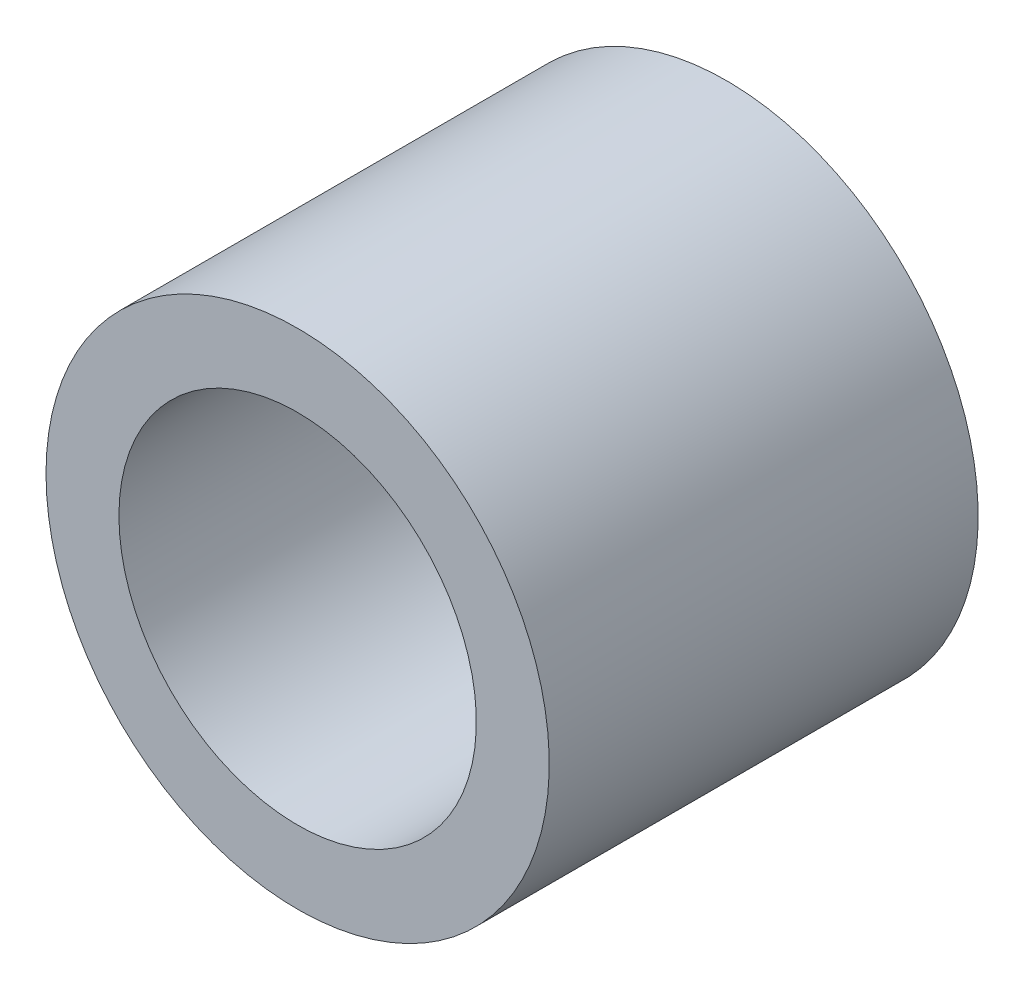
ISO-10303-21;
HEADER;
FILE_DESCRIPTION(('STEP AP214'),'2;1');
FILE_NAME('part.step','',(''),(''),'','','');
FILE_SCHEMA(('AUTOMOTIVE_DESIGN { 1 0 10303 214 1 1 1 1 }'));
ENDSEC;
DATA;
#1=APPLICATION_CONTEXT('core data for automotive mechanical design processes');
#2=APPLICATION_PROTOCOL_DEFINITION('international standard','automotive_design',2000,#1);
#3=PRODUCT_CONTEXT('',#1,'mechanical');
#4=PRODUCT('Part','Part','',(#3));
#5=PRODUCT_RELATED_PRODUCT_CATEGORY('part','',(#4));
#6=PRODUCT_DEFINITION_FORMATION('','',#4);
#7=PRODUCT_DEFINITION_CONTEXT('part definition',#1,'design');
#8=PRODUCT_DEFINITION('design','',#6,#7);
#9=PRODUCT_DEFINITION_SHAPE('','',#8);
#10=(LENGTH_UNIT() NAMED_UNIT(*) SI_UNIT(.MILLI.,.METRE.));
#11=(NAMED_UNIT(*) PLANE_ANGLE_UNIT() SI_UNIT($,.RADIAN.));
#12=(NAMED_UNIT(*) SI_UNIT($,.STERADIAN.) SOLID_ANGLE_UNIT());
#13=UNCERTAINTY_MEASURE_WITH_UNIT(LENGTH_MEASURE(1.E-05),#10,'distance_accuracy_value','');
#14=(GEOMETRIC_REPRESENTATION_CONTEXT(3) GLOBAL_UNCERTAINTY_ASSIGNED_CONTEXT((#13)) GLOBAL_UNIT_ASSIGNED_CONTEXT((#10,
#11,#12)) REPRESENTATION_CONTEXT('',''));
#15=CARTESIAN_POINT('',(0.,0.,0.));
#16=DIRECTION('',(0.,0.,1.));
#17=DIRECTION('',(1.,0.,0.));
#18=AXIS2_PLACEMENT_3D('',#15,#16,#17);
#19=CARTESIAN_POINT('',(0.,0.,4.7625));
#20=DIRECTION('',(0.,0.,1.));
#21=DIRECTION('',(1.,0.,0.));
#22=AXIS2_PLACEMENT_3D('',#19,#20,#21);
#23=PLANE('',#22);
#24=CARTESIAN_POINT('',(0.,0.,4.7625));
#25=DIRECTION('',(0.,0.,1.));
#26=DIRECTION('',(1.,0.,0.));
#27=AXIS2_PLACEMENT_3D('',#24,#25,#26);
#28=CIRCLE('',#27,5.588);
#29=CARTESIAN_POINT('',(-5.588,0.,4.7625));
#30=VERTEX_POINT('',#29);
#31=EDGE_CURVE('E10',#30,#30,#28,.T.);
#32=ORIENTED_EDGE('',*,*,#31,.T.);
#33=EDGE_LOOP('',(#32));
#34=FACE_BOUND('',#33,.T.);
#35=CARTESIAN_POINT('',(0.,0.,4.7625));
#36=DIRECTION('',(0.,0.,1.));
#37=DIRECTION('',(1.,0.,0.));
#38=AXIS2_PLACEMENT_3D('',#35,#36,#37);
#39=CIRCLE('',#38,3.96875);
#40=CARTESIAN_POINT('',(-3.96875,0.,4.7625));
#41=VERTEX_POINT('',#40);
#42=EDGE_CURVE('E42',#41,#41,#39,.T.);
#43=ORIENTED_EDGE('',*,*,#42,.F.);
#44=EDGE_LOOP('',(#43));
#45=FACE_BOUND('',#44,.T.);
#46=ADVANCED_FACE('F31',(#34,#45),#23,.T.);
#47=CARTESIAN_POINT('',(0.,0.,-4.7625));
#48=DIRECTION('',(0.,0.,1.));
#49=DIRECTION('',(1.,0.,0.));
#50=AXIS2_PLACEMENT_3D('',#47,#48,#49);
#51=PLANE('',#50);
#52=CARTESIAN_POINT('',(0.,0.,-4.7625));
#53=DIRECTION('',(0.,0.,1.));
#54=DIRECTION('',(1.,0.,0.));
#55=AXIS2_PLACEMENT_3D('',#52,#53,#54);
#56=CIRCLE('',#55,5.588);
#57=CARTESIAN_POINT('',(-5.588,0.,-4.7625));
#58=VERTEX_POINT('',#57);
#59=EDGE_CURVE('E35',#58,#58,#56,.T.);
#60=ORIENTED_EDGE('',*,*,#59,.F.);
#61=EDGE_LOOP('',(#60));
#62=FACE_BOUND('',#61,.T.);
#63=CARTESIAN_POINT('',(0.,0.,-4.7625));
#64=DIRECTION('',(0.,0.,1.));
#65=DIRECTION('',(1.,0.,0.));
#66=AXIS2_PLACEMENT_3D('',#63,#64,#65);
#67=CIRCLE('',#66,3.96875);
#68=CARTESIAN_POINT('',(-3.96875,0.,-4.7625));
#69=VERTEX_POINT('',#68);
#70=EDGE_CURVE('E44',#69,#69,#67,.T.);
#71=ORIENTED_EDGE('',*,*,#70,.T.);
#72=EDGE_LOOP('',(#71));
#73=FACE_BOUND('',#72,.T.);
#74=ADVANCED_FACE('F54',(#62,#73),#51,.F.);
#75=CARTESIAN_POINT('',(0.,0.,4.7625));
#76=DIRECTION('',(0.,0.,-1.));
#77=DIRECTION('',(-1.,0.,0.));
#78=AXIS2_PLACEMENT_3D('',#75,#76,#77);
#79=CYLINDRICAL_SURFACE('',#78,5.588);
#80=CARTESIAN_POINT('',(-5.588,0.,4.7625));
#81=CARTESIAN_POINT('',(-5.588,0.,4.66328125));
#82=CARTESIAN_POINT('',(-5.588,0.,4.5640625));
#83=CARTESIAN_POINT('',(-5.588,0.,4.365625));
#84=CARTESIAN_POINT('',(-5.588,0.,4.26640625));
#85=CARTESIAN_POINT('',(-5.588,0.,4.06796875));
#86=CARTESIAN_POINT('',(-5.588,0.,3.96875));
#87=CARTESIAN_POINT('',(-5.588,0.,3.7703125));
#88=CARTESIAN_POINT('',(-5.588,0.,3.67109375));
#89=CARTESIAN_POINT('',(-5.588,0.,3.47265625));
#90=CARTESIAN_POINT('',(-5.588,0.,3.3734375));
#91=CARTESIAN_POINT('',(-5.588,0.,3.175));
#92=CARTESIAN_POINT('',(-5.588,0.,3.07578125));
#93=CARTESIAN_POINT('',(-5.588,0.,2.87734375));
#94=CARTESIAN_POINT('',(-5.588,0.,2.778125));
#95=CARTESIAN_POINT('',(-5.588,0.,2.5796875));
#96=CARTESIAN_POINT('',(-5.588,0.,2.48046875));
#97=CARTESIAN_POINT('',(-5.588,0.,2.28203125));
#98=CARTESIAN_POINT('',(-5.588,0.,2.1828125));
#99=CARTESIAN_POINT('',(-5.588,0.,1.984375));
#100=CARTESIAN_POINT('',(-5.588,0.,1.88515625));
#101=CARTESIAN_POINT('',(-5.588,0.,1.68671875));
#102=CARTESIAN_POINT('',(-5.588,0.,1.5875));
#103=CARTESIAN_POINT('',(-5.588,0.,1.3890625));
#104=CARTESIAN_POINT('',(-5.588,0.,1.28984375));
#105=CARTESIAN_POINT('',(-5.588,0.,1.09140625));
#106=CARTESIAN_POINT('',(-5.588,0.,0.992187499999999));
#107=CARTESIAN_POINT('',(-5.588,0.,0.793749999999999));
#108=CARTESIAN_POINT('',(-5.588,0.,0.694531249999999));
#109=CARTESIAN_POINT('',(-5.588,0.,0.496093749999999));
#110=CARTESIAN_POINT('',(-5.588,0.,0.396874999999999));
#111=CARTESIAN_POINT('',(-5.588,0.,0.198437499999999));
#112=CARTESIAN_POINT('',(-5.588,0.,0.0992187499999992));
#113=CARTESIAN_POINT('',(-5.588,0.,-0.0992187500000009));
#114=CARTESIAN_POINT('',(-5.588,0.,-0.198437500000001));
#115=CARTESIAN_POINT('',(-5.588,0.,-0.396875000000001));
#116=CARTESIAN_POINT('',(-5.588,0.,-0.496093750000001));
#117=CARTESIAN_POINT('',(-5.588,0.,-0.694531250000001));
#118=CARTESIAN_POINT('',(-5.588,0.,-0.793750000000001));
#119=CARTESIAN_POINT('',(-5.588,0.,-0.992187500000002));
#120=CARTESIAN_POINT('',(-5.588,0.,-1.09140625));
#121=CARTESIAN_POINT('',(-5.588,0.,-1.28984375));
#122=CARTESIAN_POINT('',(-5.588,0.,-1.3890625));
#123=CARTESIAN_POINT('',(-5.588,0.,-1.5875));
#124=CARTESIAN_POINT('',(-5.588,0.,-1.68671875));
#125=CARTESIAN_POINT('',(-5.588,0.,-1.88515625));
#126=CARTESIAN_POINT('',(-5.588,0.,-1.984375));
#127=CARTESIAN_POINT('',(-5.588,0.,-2.1828125));
#128=CARTESIAN_POINT('',(-5.588,0.,-2.28203125));
#129=CARTESIAN_POINT('',(-5.588,0.,-2.48046875));
#130=CARTESIAN_POINT('',(-5.588,0.,-2.5796875));
#131=CARTESIAN_POINT('',(-5.588,0.,-2.778125));
#132=CARTESIAN_POINT('',(-5.588,0.,-2.87734375));
#133=CARTESIAN_POINT('',(-5.588,0.,-3.07578125));
#134=CARTESIAN_POINT('',(-5.588,0.,-3.175));
#135=CARTESIAN_POINT('',(-5.588,0.,-3.3734375));
#136=CARTESIAN_POINT('',(-5.588,0.,-3.47265625));
#137=CARTESIAN_POINT('',(-5.588,0.,-3.67109375));
#138=CARTESIAN_POINT('',(-5.588,0.,-3.7703125));
#139=CARTESIAN_POINT('',(-5.588,0.,-3.96875));
#140=CARTESIAN_POINT('',(-5.588,0.,-4.06796875));
#141=CARTESIAN_POINT('',(-5.588,0.,-4.26640625));
#142=CARTESIAN_POINT('',(-5.588,0.,-4.365625));
#143=CARTESIAN_POINT('',(-5.588,0.,-4.5640625));
#144=CARTESIAN_POINT('',(-5.588,0.,-4.66328125));
#145=CARTESIAN_POINT('',(-5.588,0.,-4.7625));
#146=B_SPLINE_CURVE_WITH_KNOTS('',3,(#80,#81,#82,#83,#84,#85,#86,#87,#88,#89,#90,#91,#92,#93,
#94,#95,#96,#97,#98,#99,#100,#101,#102,#103,#104,#105,#106,#107,#108,#109,#110,#111,#112,#113,
#114,#115,#116,#117,#118,#119,#120,#121,#122,#123,#124,#125,#126,#127,#128,#129,#130,#131,#132,
#133,#134,#135,#136,#137,#138,#139,#140,#141,#142,#143,#144,#145),.UNSPECIFIED.,.F.,.F.,(4,2,2,
2,2,2,2,2,2,2,2,2,2,2,2,2,2,2,2,2,2,2,2,2,2,2,2,2,2,2,2,2,4),(0.,0.297656249999999,
0.595312499999999,0.89296875,1.190625,1.48828125,1.7859375,2.08359375,2.38125,2.67890625,
2.9765625,3.27421875,3.571875,3.86953125,4.1671875,4.46484375,4.7625,5.06015625,5.3578125,
5.65546875,5.953125,6.25078125,6.5484375,6.84609375,7.14375,7.44140625,7.7390625,8.03671875,
8.334375,8.63203125,8.9296875,9.22734375,9.525),.UNSPECIFIED.);
#147=EDGE_CURVE('BSEAM33',#30,#58,#146,.T.);
#148=ORIENTED_EDGE('',*,*,#31,.F.);
#149=ORIENTED_EDGE('',*,*,#59,.T.);
#150=ORIENTED_EDGE('',*,*,#147,.T.);
#151=ORIENTED_EDGE('',*,*,#147,.F.);
#152=EDGE_LOOP('',(#148,#150,#149,#151));
#153=FACE_BOUND('',#152,.T.);
#154=ADVANCED_FACE('F33',(#153),#79,.T.);
#155=CARTESIAN_POINT('',(0.,0.,4.7625));
#156=DIRECTION('',(0.,0.,-1.));
#157=DIRECTION('',(-1.,0.,0.));
#158=AXIS2_PLACEMENT_3D('',#155,#156,#157);
#159=CYLINDRICAL_SURFACE('',#158,3.96875);
#160=CARTESIAN_POINT('',(-3.96875,0.,4.7625));
#161=CARTESIAN_POINT('',(-3.96875,0.,4.66328125));
#162=CARTESIAN_POINT('',(-3.96875,0.,4.5640625));
#163=CARTESIAN_POINT('',(-3.96875,0.,4.365625));
#164=CARTESIAN_POINT('',(-3.96875,0.,4.26640625));
#165=CARTESIAN_POINT('',(-3.96875,0.,4.06796875));
#166=CARTESIAN_POINT('',(-3.96875,0.,3.96875));
#167=CARTESIAN_POINT('',(-3.96875,0.,3.7703125));
#168=CARTESIAN_POINT('',(-3.96875,0.,3.67109375));
#169=CARTESIAN_POINT('',(-3.96875,0.,3.47265625));
#170=CARTESIAN_POINT('',(-3.96875,0.,3.3734375));
#171=CARTESIAN_POINT('',(-3.96875,0.,3.175));
#172=CARTESIAN_POINT('',(-3.96875,0.,3.07578125));
#173=CARTESIAN_POINT('',(-3.96875,0.,2.87734375));
#174=CARTESIAN_POINT('',(-3.96875,0.,2.778125));
#175=CARTESIAN_POINT('',(-3.96875,0.,2.5796875));
#176=CARTESIAN_POINT('',(-3.96875,0.,2.48046875));
#177=CARTESIAN_POINT('',(-3.96875,0.,2.28203125));
#178=CARTESIAN_POINT('',(-3.96875,0.,2.1828125));
#179=CARTESIAN_POINT('',(-3.96875,0.,1.984375));
#180=CARTESIAN_POINT('',(-3.96875,0.,1.88515625));
#181=CARTESIAN_POINT('',(-3.96875,0.,1.68671875));
#182=CARTESIAN_POINT('',(-3.96875,0.,1.5875));
#183=CARTESIAN_POINT('',(-3.96875,0.,1.3890625));
#184=CARTESIAN_POINT('',(-3.96875,0.,1.28984375));
#185=CARTESIAN_POINT('',(-3.96875,0.,1.09140625));
#186=CARTESIAN_POINT('',(-3.96875,0.,0.992187499999999));
#187=CARTESIAN_POINT('',(-3.96875,0.,0.793749999999999));
#188=CARTESIAN_POINT('',(-3.96875,0.,0.694531249999999));
#189=CARTESIAN_POINT('',(-3.96875,0.,0.496093749999999));
#190=CARTESIAN_POINT('',(-3.96875,0.,0.396874999999999));
#191=CARTESIAN_POINT('',(-3.96875,0.,0.198437499999999));
#192=CARTESIAN_POINT('',(-3.96875,0.,0.0992187499999992));
#193=CARTESIAN_POINT('',(-3.96875,0.,-0.0992187500000009));
#194=CARTESIAN_POINT('',(-3.96875,0.,-0.198437500000001));
#195=CARTESIAN_POINT('',(-3.96875,0.,-0.396875000000001));
#196=CARTESIAN_POINT('',(-3.96875,0.,-0.496093750000001));
#197=CARTESIAN_POINT('',(-3.96875,0.,-0.694531250000001));
#198=CARTESIAN_POINT('',(-3.96875,0.,-0.793750000000001));
#199=CARTESIAN_POINT('',(-3.96875,0.,-0.992187500000002));
#200=CARTESIAN_POINT('',(-3.96875,0.,-1.09140625));
#201=CARTESIAN_POINT('',(-3.96875,0.,-1.28984375));
#202=CARTESIAN_POINT('',(-3.96875,0.,-1.3890625));
#203=CARTESIAN_POINT('',(-3.96875,0.,-1.5875));
#204=CARTESIAN_POINT('',(-3.96875,0.,-1.68671875));
#205=CARTESIAN_POINT('',(-3.96875,0.,-1.88515625));
#206=CARTESIAN_POINT('',(-3.96875,0.,-1.984375));
#207=CARTESIAN_POINT('',(-3.96875,0.,-2.1828125));
#208=CARTESIAN_POINT('',(-3.96875,0.,-2.28203125));
#209=CARTESIAN_POINT('',(-3.96875,0.,-2.48046875));
#210=CARTESIAN_POINT('',(-3.96875,0.,-2.5796875));
#211=CARTESIAN_POINT('',(-3.96875,0.,-2.778125));
#212=CARTESIAN_POINT('',(-3.96875,0.,-2.87734375));
#213=CARTESIAN_POINT('',(-3.96875,0.,-3.07578125));
#214=CARTESIAN_POINT('',(-3.96875,0.,-3.175));
#215=CARTESIAN_POINT('',(-3.96875,0.,-3.3734375));
#216=CARTESIAN_POINT('',(-3.96875,0.,-3.47265625));
#217=CARTESIAN_POINT('',(-3.96875,0.,-3.67109375));
#218=CARTESIAN_POINT('',(-3.96875,0.,-3.7703125));
#219=CARTESIAN_POINT('',(-3.96875,0.,-3.96875));
#220=CARTESIAN_POINT('',(-3.96875,0.,-4.06796875));
#221=CARTESIAN_POINT('',(-3.96875,0.,-4.26640625));
#222=CARTESIAN_POINT('',(-3.96875,0.,-4.365625));
#223=CARTESIAN_POINT('',(-3.96875,0.,-4.5640625));
#224=CARTESIAN_POINT('',(-3.96875,0.,-4.66328125));
#225=CARTESIAN_POINT('',(-3.96875,0.,-4.7625));
#226=B_SPLINE_CURVE_WITH_KNOTS('',3,(#160,#161,#162,#163,#164,#165,#166,#167,#168,#169,#170,
#171,#172,#173,#174,#175,#176,#177,#178,#179,#180,#181,#182,#183,#184,#185,#186,#187,#188,#189,
#190,#191,#192,#193,#194,#195,#196,#197,#198,#199,#200,#201,#202,#203,#204,#205,#206,#207,#208,
#209,#210,#211,#212,#213,#214,#215,#216,#217,#218,#219,#220,#221,#222,#223,#224,#225),
.UNSPECIFIED.,.F.,.F.,(4,2,2,2,2,2,2,2,2,2,2,2,2,2,2,2,2,2,2,2,2,2,2,2,2,2,2,2,2,2,2,2,4),(0.,
0.297656249999999,0.595312499999999,0.89296875,1.190625,1.48828125,1.7859375,2.08359375,2.38125,
2.67890625,2.9765625,3.27421875,3.571875,3.86953125,4.1671875,4.46484375,4.7625,5.06015625,
5.3578125,5.65546875,5.953125,6.25078125,6.5484375,6.84609375,7.14375,7.44140625,7.7390625,
8.03671875,8.334375,8.63203125,8.9296875,9.22734375,9.525),.UNSPECIFIED.);
#227=EDGE_CURVE('BSEAM50',#41,#69,#226,.T.);
#228=ORIENTED_EDGE('',*,*,#42,.T.);
#229=ORIENTED_EDGE('',*,*,#70,.F.);
#230=ORIENTED_EDGE('',*,*,#227,.T.);
#231=ORIENTED_EDGE('',*,*,#227,.F.);
#232=EDGE_LOOP('',(#228,#230,#229,#231));
#233=FACE_BOUND('',#232,.T.);
#234=ADVANCED_FACE('F50',(#233),#159,.F.);
#235=CLOSED_SHELL('',(#46,#74,#154,#234));
#236=MANIFOLD_SOLID_BREP('B2',#235);
#237=ADVANCED_BREP_SHAPE_REPRESENTATION('',(#18,#236),#14);
#238=SHAPE_DEFINITION_REPRESENTATION(#9,#237);
ENDSEC;
END-ISO-10303-21;
